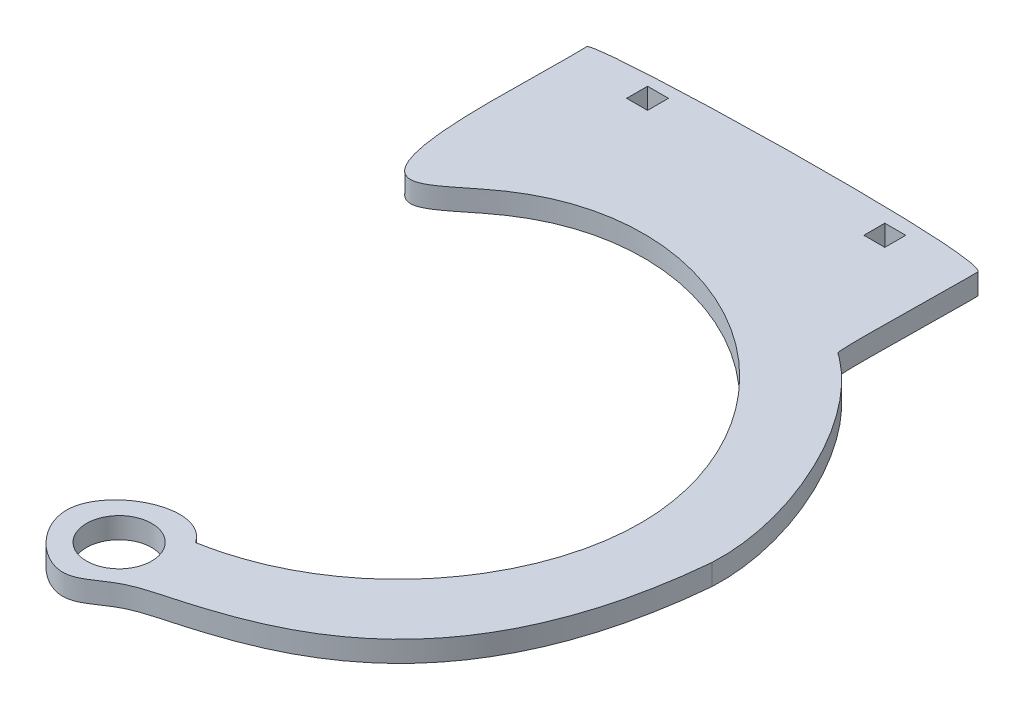
ISO-10303-21;
HEADER;
FILE_DESCRIPTION(('STEP AP214'),'2;1');
FILE_NAME('part.step','',(''),(''),'','','');
FILE_SCHEMA(('AUTOMOTIVE_DESIGN { 1 0 10303 214 1 1 1 1 }'));
ENDSEC;
DATA;
#1=APPLICATION_CONTEXT('core data for automotive mechanical design processes');
#2=APPLICATION_PROTOCOL_DEFINITION('international standard','automotive_design',2000,#1);
#3=PRODUCT_CONTEXT('',#1,'mechanical');
#4=PRODUCT('Part','Part','',(#3));
#5=PRODUCT_RELATED_PRODUCT_CATEGORY('part','',(#4));
#6=PRODUCT_DEFINITION_FORMATION('','',#4);
#7=PRODUCT_DEFINITION_CONTEXT('part definition',#1,'design');
#8=PRODUCT_DEFINITION('design','',#6,#7);
#9=PRODUCT_DEFINITION_SHAPE('','',#8);
#10=(LENGTH_UNIT() NAMED_UNIT(*) SI_UNIT(.MILLI.,.METRE.));
#11=(NAMED_UNIT(*) PLANE_ANGLE_UNIT() SI_UNIT($,.RADIAN.));
#12=(NAMED_UNIT(*) SI_UNIT($,.STERADIAN.) SOLID_ANGLE_UNIT());
#13=UNCERTAINTY_MEASURE_WITH_UNIT(LENGTH_MEASURE(1.E-05),#10,'distance_accuracy_value','');
#14=(GEOMETRIC_REPRESENTATION_CONTEXT(3) GLOBAL_UNCERTAINTY_ASSIGNED_CONTEXT((#13)) GLOBAL_UNIT_ASSIGNED_CONTEXT((#10,
#11,#12)) REPRESENTATION_CONTEXT('',''));
#15=CARTESIAN_POINT('',(0.,0.,0.));
#16=DIRECTION('',(0.,0.,1.));
#17=DIRECTION('',(1.,0.,0.));
#18=AXIS2_PLACEMENT_3D('',#15,#16,#17);
#19=CARTESIAN_POINT('',(5.52155748370861,3.,34.56171875));
#20=CARTESIAN_POINT('',(1.75457626593996,3.,29.0678926339568));
#21=CARTESIAN_POINT('',(-14.2628126377582,3.,37.3251737999894));
#22=CARTESIAN_POINT('',(-0.816124687698605,3.,50.4605636092557));
#23=CARTESIAN_POINT('',(4.47781550421018,3.,44.8708590645014));
#24=CARTESIAN_POINT('',(19.7672053678462,3.,40.7525704051218));
#25=CARTESIAN_POINT('',(41.8350730212651,3.,33.8354091874432));
#26=CARTESIAN_POINT('',(45.,3.,0.));
#27=B_SPLINE_CURVE_WITH_KNOTS('',3,(#19,#20,#21,#22,#23,#24,#25,#26),.UNSPECIFIED.,.F.,.F.,(4,1,
1,1,1,4),(0.,0.248435928445645,0.409115666517532,0.501869332977568,0.560957766325815,1.),.UNSPECIFIED.);
#28=DIRECTION('',(0.,-1.,0.));
#29=VECTOR('',#28,1.);
#30=SURFACE_OF_LINEAR_EXTRUSION('',#27,#29);
#31=CARTESIAN_POINT('',(5.52155748370861,0.,34.56171875));
#32=CARTESIAN_POINT('',(1.75457626593996,0.,29.0678926339568));
#33=CARTESIAN_POINT('',(-14.2628126377582,0.,37.3251737999894));
#34=CARTESIAN_POINT('',(-0.816124687698605,0.,50.4605636092557));
#35=CARTESIAN_POINT('',(4.47781550421018,0.,44.8708590645014));
#36=CARTESIAN_POINT('',(19.7672053678462,0.,40.7525704051218));
#37=CARTESIAN_POINT('',(41.8350730212651,0.,33.8354091874432));
#38=CARTESIAN_POINT('',(45.,0.,0.));
#39=B_SPLINE_CURVE_WITH_KNOTS('',3,(#31,#32,#33,#34,#35,#36,#37,#38),.UNSPECIFIED.,.F.,.F.,(4,1,
1,1,1,4),(0.,0.248435928445645,0.409115666517532,0.501869332977568,0.560957766325815,1.),.UNSPECIFIED.);
#40=CARTESIAN_POINT('',(5.5215574837086,0.,34.56171875));
#41=VERTEX_POINT('',#40);
#42=CARTESIAN_POINT('',(45.,0.,1.28897821374382E-13));
#43=VERTEX_POINT('',#42);
#44=EDGE_CURVE('E182',#41,#43,#39,.T.);
#45=ORIENTED_EDGE('',*,*,#44,.T.);
#46=DIRECTION('',(0.,-1.,0.));
#47=VECTOR('',#46,1.);
#48=CARTESIAN_POINT('',(45.,3.,1.28897821374382E-13));
#49=LINE('',#48,#47);
#50=CARTESIAN_POINT('',(45.,3.,1.28897821374382E-13));
#51=VERTEX_POINT('',#50);
#52=EDGE_CURVE('E11',#51,#43,#49,.T.);
#53=ORIENTED_EDGE('',*,*,#52,.F.);
#54=CARTESIAN_POINT('',(5.5215574837086,3.,34.56171875));
#55=VERTEX_POINT('',#54);
#56=EDGE_CURVE('E184',#55,#51,#27,.T.);
#57=ORIENTED_EDGE('',*,*,#56,.F.);
#58=DIRECTION('',(0.,-1.,0.));
#59=VECTOR('',#58,1.);
#60=CARTESIAN_POINT('',(5.5215574837086,3.,34.56171875));
#61=LINE('',#60,#59);
#62=EDGE_CURVE('E40',#55,#41,#61,.T.);
#63=ORIENTED_EDGE('',*,*,#62,.T.);
#64=EDGE_LOOP('',(#45,#53,#57,#63));
#65=FACE_BOUND('',#64,.T.);
#66=ADVANCED_FACE('F32',(#65),#30,.F.);
#67=CARTESIAN_POINT('',(45.,3.,1.28897821374382E-13));
#68=CARTESIAN_POINT('',(45.5872356507686,3.,-11.4498091188039));
#69=CARTESIAN_POINT('',(37.5515269769713,3.,-28.3604836527118));
#70=CARTESIAN_POINT('',(27.6537379425122,3.,-35.2406958171902));
#71=CARTESIAN_POINT('',(27.9669395349281,3.,-46.9502889949367));
#72=CARTESIAN_POINT('',(28.0110395879902,3.,-57.6879686278624));
#73=CARTESIAN_POINT('',(-28.043237247077,3.,-56.5041897316936));
#74=CARTESIAN_POINT('',(-27.7225426285753,3.,-45.3474768332037));
#75=CARTESIAN_POINT('',(-30.2261834831274,3.,-17.9966032347248));
#76=CARTESIAN_POINT('',(-9.40725411177826,3.,-38.5434879286303));
#77=CARTESIAN_POINT('',(20.3750158900972,3.,-35.3512461572392));
#78=CARTESIAN_POINT('',(44.4623985292645,3.,2.85883580250558));
#79=CARTESIAN_POINT('',(23.4410009987943,3.,31.4117383992043));
#80=CARTESIAN_POINT('',(5.5215574837086,3.,34.56171875));
#81=B_SPLINE_CURVE_WITH_KNOTS('',3,(#67,#68,#69,#70,#71,#72,#73,#74,#75,#76,#77,#78,#79,#80),
.UNSPECIFIED.,.F.,.F.,(4,2,2,2,1,1,1,1,4),(0.,0.689052401124645,0.714031936093828,
0.722373130739638,0.775899340140621,0.791729341638379,0.851260650378715,0.917162435133628,1.),.UNSPECIFIED.);
#82=DIRECTION('',(0.,-1.,0.));
#83=VECTOR('',#82,1.);
#84=SURFACE_OF_LINEAR_EXTRUSION('',#81,#83);
#85=CARTESIAN_POINT('',(45.,0.,1.28897821374382E-13));
#86=CARTESIAN_POINT('',(45.5872356507686,0.,-11.4498091188039));
#87=CARTESIAN_POINT('',(37.5515269769713,0.,-28.3604836527118));
#88=CARTESIAN_POINT('',(27.6537379425122,0.,-35.2406958171902));
#89=CARTESIAN_POINT('',(27.9669395349281,0.,-46.9502889949367));
#90=CARTESIAN_POINT('',(28.0110395879902,0.,-57.6879686278624));
#91=CARTESIAN_POINT('',(-28.043237247077,0.,-56.5041897316936));
#92=CARTESIAN_POINT('',(-27.7225426285753,0.,-45.3474768332037));
#93=CARTESIAN_POINT('',(-30.2261834831274,0.,-17.9966032347248));
#94=CARTESIAN_POINT('',(-9.40725411177826,0.,-38.5434879286303));
#95=CARTESIAN_POINT('',(20.3750158900972,0.,-35.3512461572392));
#96=CARTESIAN_POINT('',(44.4623985292645,0.,2.85883580250558));
#97=CARTESIAN_POINT('',(23.4410009987943,0.,31.4117383992043));
#98=CARTESIAN_POINT('',(5.5215574837086,0.,34.56171875));
#99=B_SPLINE_CURVE_WITH_KNOTS('',3,(#85,#86,#87,#88,#89,#90,#91,#92,#93,#94,#95,#96,#97,#98),
.UNSPECIFIED.,.F.,.F.,(4,2,2,2,1,1,1,1,4),(0.,0.689052401124645,0.714031936093828,
0.722373130739638,0.775899340140621,0.791729341638379,0.851260650378715,0.917162435133628,1.),.UNSPECIFIED.);
#100=EDGE_CURVE('E191',#43,#41,#99,.T.);
#101=ORIENTED_EDGE('',*,*,#100,.T.);
#102=ORIENTED_EDGE('',*,*,#62,.F.);
#103=EDGE_CURVE('E190',#51,#55,#81,.T.);
#104=ORIENTED_EDGE('',*,*,#103,.F.);
#105=ORIENTED_EDGE('',*,*,#52,.T.);
#106=EDGE_LOOP('',(#101,#102,#104,#105));
#107=FACE_BOUND('',#106,.T.);
#108=ADVANCED_FACE('F205',(#107),#84,.F.);
#109=CARTESIAN_POINT('',(5.42939376748954,3.,44.9508710166322));
#110=DIRECTION('',(0.,1.,0.));
#111=DIRECTION('',(0.,0.,1.));
#112=AXIS2_PLACEMENT_3D('',#109,#110,#111);
#113=PLANE('',#112);
#114=DIRECTION('',(0.,0.,1.));
#115=VECTOR('',#114,1.);
#116=CARTESIAN_POINT('',(-18.7256799623653,3.,44.9508710166322));
#117=LINE('',#116,#115);
#118=CARTESIAN_POINT('',(-18.7256799623653,3.,-54.4621773366732));
#119=VERTEX_POINT('',#118);
#120=CARTESIAN_POINT('',(-18.7256799623653,3.,-51.4621773366732));
#121=VERTEX_POINT('',#120);
#122=EDGE_CURVE('E114',#119,#121,#117,.T.);
#123=ORIENTED_EDGE('',*,*,#122,.F.);
#124=DIRECTION('',(-1.,0.,0.));
#125=VECTOR('',#124,1.);
#126=CARTESIAN_POINT('',(5.42939376748954,3.,-54.4621773366732));
#127=LINE('',#126,#125);
#128=CARTESIAN_POINT('',(-15.7256799623653,3.,-54.4621773366732));
#129=VERTEX_POINT('',#128);
#130=EDGE_CURVE('E175',#129,#119,#127,.T.);
#131=ORIENTED_EDGE('',*,*,#130,.F.);
#132=DIRECTION('',(0.,0.,-1.));
#133=VECTOR('',#132,1.);
#134=CARTESIAN_POINT('',(-15.7256799623653,3.,44.9508710166322));
#135=LINE('',#134,#133);
#136=CARTESIAN_POINT('',(-15.7256799623653,3.,-51.4621773366732));
#137=VERTEX_POINT('',#136);
#138=EDGE_CURVE('E173',#137,#129,#135,.T.);
#139=ORIENTED_EDGE('',*,*,#138,.F.);
#140=DIRECTION('',(1.,0.,0.));
#141=VECTOR('',#140,1.);
#142=CARTESIAN_POINT('',(5.42939376748954,3.,-51.4621773366732));
#143=LINE('',#142,#141);
#144=EDGE_CURVE('E171',#121,#137,#143,.T.);
#145=ORIENTED_EDGE('',*,*,#144,.F.);
#146=EDGE_LOOP('',(#123,#131,#139,#145));
#147=FACE_BOUND('',#146,.T.);
#148=DIRECTION('',(0.,0.,1.));
#149=VECTOR('',#148,1.);
#150=CARTESIAN_POINT('',(15.2743200376348,3.,44.9508710166322));
#151=LINE('',#150,#149);
#152=CARTESIAN_POINT('',(15.2743200376348,3.,-54.4621773366732));
#153=VERTEX_POINT('',#152);
#154=CARTESIAN_POINT('',(15.2743200376348,3.,-51.4621773366732));
#155=VERTEX_POINT('',#154);
#156=EDGE_CURVE('E169',#153,#155,#151,.T.);
#157=ORIENTED_EDGE('',*,*,#156,.F.);
#158=DIRECTION('',(-1.,0.,0.));
#159=VECTOR('',#158,1.);
#160=CARTESIAN_POINT('',(5.42939376748954,3.,-54.4621773366732));
#161=LINE('',#160,#159);
#162=CARTESIAN_POINT('',(18.2743200376348,3.,-54.4621773366732));
#163=VERTEX_POINT('',#162);
#164=EDGE_CURVE('E167',#163,#153,#161,.T.);
#165=ORIENTED_EDGE('',*,*,#164,.F.);
#166=DIRECTION('',(0.,0.,-1.));
#167=VECTOR('',#166,1.);
#168=CARTESIAN_POINT('',(18.2743200376348,3.,44.9508710166322));
#169=LINE('',#168,#167);
#170=CARTESIAN_POINT('',(18.2743200376348,3.,-51.4621773366732));
#171=VERTEX_POINT('',#170);
#172=EDGE_CURVE('E165',#171,#163,#169,.T.);
#173=ORIENTED_EDGE('',*,*,#172,.F.);
#174=DIRECTION('',(1.,0.,0.));
#175=VECTOR('',#174,1.);
#176=CARTESIAN_POINT('',(5.42939376748954,3.,-51.4621773366732));
#177=LINE('',#176,#175);
#178=EDGE_CURVE('E141',#155,#171,#177,.T.);
#179=ORIENTED_EDGE('',*,*,#178,.F.);
#180=EDGE_LOOP('',(#157,#165,#173,#179));
#181=FACE_BOUND('',#180,.T.);
#182=CARTESIAN_POINT('',(0.,3.,40.));
#183=DIRECTION('',(0.,1.,0.));
#184=DIRECTION('',(0.,0.,1.));
#185=AXIS2_PLACEMENT_3D('',#182,#183,#184);
#186=CIRCLE('',#185,4.675);
#187=CARTESIAN_POINT('',(0.,3.,44.675));
#188=VERTEX_POINT('',#187);
#189=EDGE_CURVE('E178',#188,#188,#186,.T.);
#190=ORIENTED_EDGE('',*,*,#189,.F.);
#191=EDGE_LOOP('',(#190));
#192=FACE_BOUND('',#191,.T.);
#193=ORIENTED_EDGE('',*,*,#56,.T.);
#194=ORIENTED_EDGE('',*,*,#103,.T.);
#195=EDGE_LOOP('',(#193,#194));
#196=FACE_BOUND('',#195,.T.);
#197=ADVANCED_FACE('F208',(#147,#181,#192,#196),#113,.T.);
#198=CARTESIAN_POINT('',(5.42939376748954,0.,44.9508710166322));
#199=DIRECTION('',(0.,1.,0.));
#200=DIRECTION('',(0.,0.,1.));
#201=AXIS2_PLACEMENT_3D('',#198,#199,#200);
#202=PLANE('',#201);
#203=DIRECTION('',(-1.,0.,0.));
#204=VECTOR('',#203,1.);
#205=CARTESIAN_POINT('',(-18.7256799623653,0.,-54.4621773366732));
#206=LINE('',#205,#204);
#207=CARTESIAN_POINT('',(-15.7256799623653,0.,-54.4621773366732));
#208=VERTEX_POINT('',#207);
#209=CARTESIAN_POINT('',(-18.7256799623653,0.,-54.4621773366732));
#210=VERTEX_POINT('',#209);
#211=EDGE_CURVE('E117',#208,#210,#206,.T.);
#212=ORIENTED_EDGE('',*,*,#211,.T.);
#213=DIRECTION('',(0.,0.,1.));
#214=VECTOR('',#213,1.);
#215=CARTESIAN_POINT('',(-18.7256799623653,0.,-54.4621773366732));
#216=LINE('',#215,#214);
#217=CARTESIAN_POINT('',(-18.7256799623653,0.,-51.4621773366732));
#218=VERTEX_POINT('',#217);
#219=EDGE_CURVE('E111',#210,#218,#216,.T.);
#220=ORIENTED_EDGE('',*,*,#219,.T.);
#221=DIRECTION('',(1.,0.,0.));
#222=VECTOR('',#221,1.);
#223=CARTESIAN_POINT('',(-18.7256799623653,0.,-51.4621773366732));
#224=LINE('',#223,#222);
#225=CARTESIAN_POINT('',(-15.7256799623653,0.,-51.4621773366732));
#226=VERTEX_POINT('',#225);
#227=EDGE_CURVE('E121',#218,#226,#224,.T.);
#228=ORIENTED_EDGE('',*,*,#227,.T.);
#229=DIRECTION('',(0.,0.,-1.));
#230=VECTOR('',#229,1.);
#231=CARTESIAN_POINT('',(-15.7256799623653,0.,-54.4621773366732));
#232=LINE('',#231,#230);
#233=EDGE_CURVE('E126',#226,#208,#232,.T.);
#234=ORIENTED_EDGE('',*,*,#233,.T.);
#235=EDGE_LOOP('',(#212,#220,#228,#234));
#236=FACE_BOUND('',#235,.T.);
#237=DIRECTION('',(-1.,0.,0.));
#238=VECTOR('',#237,1.);
#239=CARTESIAN_POINT('',(15.2743200376348,0.,-54.4621773366732));
#240=LINE('',#239,#238);
#241=CARTESIAN_POINT('',(18.2743200376348,0.,-54.4621773366732));
#242=VERTEX_POINT('',#241);
#243=CARTESIAN_POINT('',(15.2743200376348,0.,-54.4621773366732));
#244=VERTEX_POINT('',#243);
#245=EDGE_CURVE('E155',#242,#244,#240,.T.);
#246=ORIENTED_EDGE('',*,*,#245,.T.);
#247=DIRECTION('',(0.,0.,1.));
#248=VECTOR('',#247,1.);
#249=CARTESIAN_POINT('',(15.2743200376348,0.,-51.4621773366732));
#250=LINE('',#249,#248);
#251=CARTESIAN_POINT('',(15.2743200376348,0.,-51.4621773366732));
#252=VERTEX_POINT('',#251);
#253=EDGE_CURVE('E146',#244,#252,#250,.T.);
#254=ORIENTED_EDGE('',*,*,#253,.T.);
#255=DIRECTION('',(1.,0.,0.));
#256=VECTOR('',#255,1.);
#257=CARTESIAN_POINT('',(15.2743200376348,0.,-51.4621773366732));
#258=LINE('',#257,#256);
#259=CARTESIAN_POINT('',(18.2743200376348,0.,-51.4621773366732));
#260=VERTEX_POINT('',#259);
#261=EDGE_CURVE('E149',#252,#260,#258,.T.);
#262=ORIENTED_EDGE('',*,*,#261,.T.);
#263=DIRECTION('',(0.,0.,-1.));
#264=VECTOR('',#263,1.);
#265=CARTESIAN_POINT('',(18.2743200376348,0.,-51.4621773366732));
#266=LINE('',#265,#264);
#267=EDGE_CURVE('E152',#260,#242,#266,.T.);
#268=ORIENTED_EDGE('',*,*,#267,.T.);
#269=EDGE_LOOP('',(#246,#254,#262,#268));
#270=FACE_BOUND('',#269,.T.);
#271=CARTESIAN_POINT('',(0.,0.,40.));
#272=DIRECTION('',(0.,1.,0.));
#273=DIRECTION('',(0.,0.,1.));
#274=AXIS2_PLACEMENT_3D('',#271,#272,#273);
#275=CIRCLE('',#274,4.675);
#276=CARTESIAN_POINT('',(0.,0.,44.675));
#277=VERTEX_POINT('',#276);
#278=EDGE_CURVE('E179',#277,#277,#275,.T.);
#279=ORIENTED_EDGE('',*,*,#278,.T.);
#280=EDGE_LOOP('',(#279));
#281=FACE_BOUND('',#280,.T.);
#282=ORIENTED_EDGE('',*,*,#44,.F.);
#283=ORIENTED_EDGE('',*,*,#100,.F.);
#284=EDGE_LOOP('',(#282,#283));
#285=FACE_BOUND('',#284,.T.);
#286=ADVANCED_FACE('F128',(#236,#270,#281,#285),#202,.F.);
#287=CARTESIAN_POINT('',(0.,0.,40.));
#288=DIRECTION('',(0.,1.,0.));
#289=DIRECTION('',(0.,0.,1.));
#290=AXIS2_PLACEMENT_3D('',#287,#288,#289);
#291=CYLINDRICAL_SURFACE('',#290,4.675);
#292=ORIENTED_EDGE('',*,*,#278,.F.);
#293=EDGE_LOOP('',(#292));
#294=FACE_BOUND('',#293,.T.);
#295=ORIENTED_EDGE('',*,*,#189,.T.);
#296=EDGE_LOOP('',(#295));
#297=FACE_BOUND('',#296,.T.);
#298=ADVANCED_FACE('F212',(#294,#297),#291,.F.);
#299=CARTESIAN_POINT('',(15.2743200376348,0.,-51.4621773366732));
#300=DIRECTION('',(-1.,0.,0.));
#301=DIRECTION('',(0.,0.,1.));
#302=AXIS2_PLACEMENT_3D('',#299,#300,#301);
#303=PLANE('',#302);
#304=ORIENTED_EDGE('',*,*,#156,.T.);
#305=DIRECTION('',(0.,1.,0.));
#306=VECTOR('',#305,1.);
#307=CARTESIAN_POINT('',(15.2743200376348,0.,-51.4621773366732));
#308=LINE('',#307,#306);
#309=EDGE_CURVE('E55',#252,#155,#308,.T.);
#310=ORIENTED_EDGE('',*,*,#309,.F.);
#311=ORIENTED_EDGE('',*,*,#253,.F.);
#312=DIRECTION('',(0.,1.,0.));
#313=VECTOR('',#312,1.);
#314=CARTESIAN_POINT('',(15.2743200376348,0.,-54.4621773366732));
#315=LINE('',#314,#313);
#316=EDGE_CURVE('E131',#244,#153,#315,.T.);
#317=ORIENTED_EDGE('',*,*,#316,.T.);
#318=EDGE_LOOP('',(#304,#310,#311,#317));
#319=FACE_BOUND('',#318,.T.);
#320=ADVANCED_FACE('F218',(#319),#303,.F.);
#321=CARTESIAN_POINT('',(15.2743200376348,0.,-54.4621773366732));
#322=DIRECTION('',(0.,0.,-1.));
#323=DIRECTION('',(-1.,0.,0.));
#324=AXIS2_PLACEMENT_3D('',#321,#322,#323);
#325=PLANE('',#324);
#326=ORIENTED_EDGE('',*,*,#164,.T.);
#327=ORIENTED_EDGE('',*,*,#316,.F.);
#328=ORIENTED_EDGE('',*,*,#245,.F.);
#329=DIRECTION('',(0.,1.,0.));
#330=VECTOR('',#329,1.);
#331=CARTESIAN_POINT('',(18.2743200376348,0.,-54.4621773366732));
#332=LINE('',#331,#330);
#333=EDGE_CURVE('E134',#242,#163,#332,.T.);
#334=ORIENTED_EDGE('',*,*,#333,.T.);
#335=EDGE_LOOP('',(#326,#327,#328,#334));
#336=FACE_BOUND('',#335,.T.);
#337=ADVANCED_FACE('F222',(#336),#325,.F.);
#338=CARTESIAN_POINT('',(18.2743200376348,0.,-51.4621773366732));
#339=DIRECTION('',(1.,0.,0.));
#340=DIRECTION('',(0.,0.,-1.));
#341=AXIS2_PLACEMENT_3D('',#338,#339,#340);
#342=PLANE('',#341);
#343=ORIENTED_EDGE('',*,*,#172,.T.);
#344=ORIENTED_EDGE('',*,*,#333,.F.);
#345=ORIENTED_EDGE('',*,*,#267,.F.);
#346=DIRECTION('',(0.,1.,0.));
#347=VECTOR('',#346,1.);
#348=CARTESIAN_POINT('',(18.2743200376348,0.,-51.4621773366732));
#349=LINE('',#348,#347);
#350=EDGE_CURVE('E160',#260,#171,#349,.T.);
#351=ORIENTED_EDGE('',*,*,#350,.T.);
#352=EDGE_LOOP('',(#343,#344,#345,#351));
#353=FACE_BOUND('',#352,.T.);
#354=ADVANCED_FACE('F227',(#353),#342,.F.);
#355=CARTESIAN_POINT('',(15.2743200376348,0.,-51.4621773366732));
#356=DIRECTION('',(0.,0.,1.));
#357=DIRECTION('',(1.,0.,0.));
#358=AXIS2_PLACEMENT_3D('',#355,#356,#357);
#359=PLANE('',#358);
#360=ORIENTED_EDGE('',*,*,#178,.T.);
#361=ORIENTED_EDGE('',*,*,#350,.F.);
#362=ORIENTED_EDGE('',*,*,#261,.F.);
#363=ORIENTED_EDGE('',*,*,#309,.T.);
#364=EDGE_LOOP('',(#360,#361,#362,#363));
#365=FACE_BOUND('',#364,.T.);
#366=ADVANCED_FACE('F224',(#365),#359,.F.);
#367=CARTESIAN_POINT('',(-18.7256799623653,0.,-54.4621773366732));
#368=DIRECTION('',(-1.,0.,0.));
#369=DIRECTION('',(0.,0.,1.));
#370=AXIS2_PLACEMENT_3D('',#367,#368,#369);
#371=PLANE('',#370);
#372=ORIENTED_EDGE('',*,*,#122,.T.);
#373=DIRECTION('',(0.,1.,0.));
#374=VECTOR('',#373,1.);
#375=CARTESIAN_POINT('',(-18.7256799623653,0.,-51.4621773366732));
#376=LINE('',#375,#374);
#377=EDGE_CURVE('E47',#218,#121,#376,.T.);
#378=ORIENTED_EDGE('',*,*,#377,.F.);
#379=ORIENTED_EDGE('',*,*,#219,.F.);
#380=DIRECTION('',(0.,1.,0.));
#381=VECTOR('',#380,1.);
#382=CARTESIAN_POINT('',(-18.7256799623653,0.,-54.4621773366732));
#383=LINE('',#382,#381);
#384=EDGE_CURVE('E139',#210,#119,#383,.T.);
#385=ORIENTED_EDGE('',*,*,#384,.T.);
#386=EDGE_LOOP('',(#372,#378,#379,#385));
#387=FACE_BOUND('',#386,.T.);
#388=ADVANCED_FACE('F108',(#387),#371,.F.);
#389=CARTESIAN_POINT('',(-18.7256799623653,0.,-54.4621773366732));
#390=DIRECTION('',(0.,0.,-1.));
#391=DIRECTION('',(-1.,0.,0.));
#392=AXIS2_PLACEMENT_3D('',#389,#390,#391);
#393=PLANE('',#392);
#394=ORIENTED_EDGE('',*,*,#130,.T.);
#395=ORIENTED_EDGE('',*,*,#384,.F.);
#396=ORIENTED_EDGE('',*,*,#211,.F.);
#397=DIRECTION('',(0.,1.,0.));
#398=VECTOR('',#397,1.);
#399=CARTESIAN_POINT('',(-15.7256799623653,0.,-54.4621773366732));
#400=LINE('',#399,#398);
#401=EDGE_CURVE('E142',#208,#129,#400,.T.);
#402=ORIENTED_EDGE('',*,*,#401,.T.);
#403=EDGE_LOOP('',(#394,#395,#396,#402));
#404=FACE_BOUND('',#403,.T.);
#405=ADVANCED_FACE('F236',(#404),#393,.F.);
#406=CARTESIAN_POINT('',(-15.7256799623653,0.,-54.4621773366732));
#407=DIRECTION('',(1.,0.,0.));
#408=DIRECTION('',(0.,0.,-1.));
#409=AXIS2_PLACEMENT_3D('',#406,#407,#408);
#410=PLANE('',#409);
#411=ORIENTED_EDGE('',*,*,#138,.T.);
#412=ORIENTED_EDGE('',*,*,#401,.F.);
#413=ORIENTED_EDGE('',*,*,#233,.F.);
#414=DIRECTION('',(0.,1.,0.));
#415=VECTOR('',#414,1.);
#416=CARTESIAN_POINT('',(-15.7256799623653,0.,-51.4621773366732));
#417=LINE('',#416,#415);
#418=EDGE_CURVE('E116',#226,#137,#417,.T.);
#419=ORIENTED_EDGE('',*,*,#418,.T.);
#420=EDGE_LOOP('',(#411,#412,#413,#419));
#421=FACE_BOUND('',#420,.T.);
#422=ADVANCED_FACE('F239',(#421),#410,.F.);
#423=CARTESIAN_POINT('',(-18.7256799623653,0.,-51.4621773366732));
#424=DIRECTION('',(0.,0.,1.));
#425=DIRECTION('',(1.,0.,0.));
#426=AXIS2_PLACEMENT_3D('',#423,#424,#425);
#427=PLANE('',#426);
#428=ORIENTED_EDGE('',*,*,#144,.T.);
#429=ORIENTED_EDGE('',*,*,#418,.F.);
#430=ORIENTED_EDGE('',*,*,#227,.F.);
#431=ORIENTED_EDGE('',*,*,#377,.T.);
#432=EDGE_LOOP('',(#428,#429,#430,#431));
#433=FACE_BOUND('',#432,.T.);
#434=ADVANCED_FACE('F122',(#433),#427,.F.);
#435=CLOSED_SHELL('',(#66,#108,#197,#286,#298,#320,#337,#354,#366,#388,#405,#422,#434));
#436=MANIFOLD_SOLID_BREP('B2',#435);
#437=ADVANCED_BREP_SHAPE_REPRESENTATION('',(#18,#436),#14);
#438=SHAPE_DEFINITION_REPRESENTATION(#9,#437);
ENDSEC;
END-ISO-10303-21;
